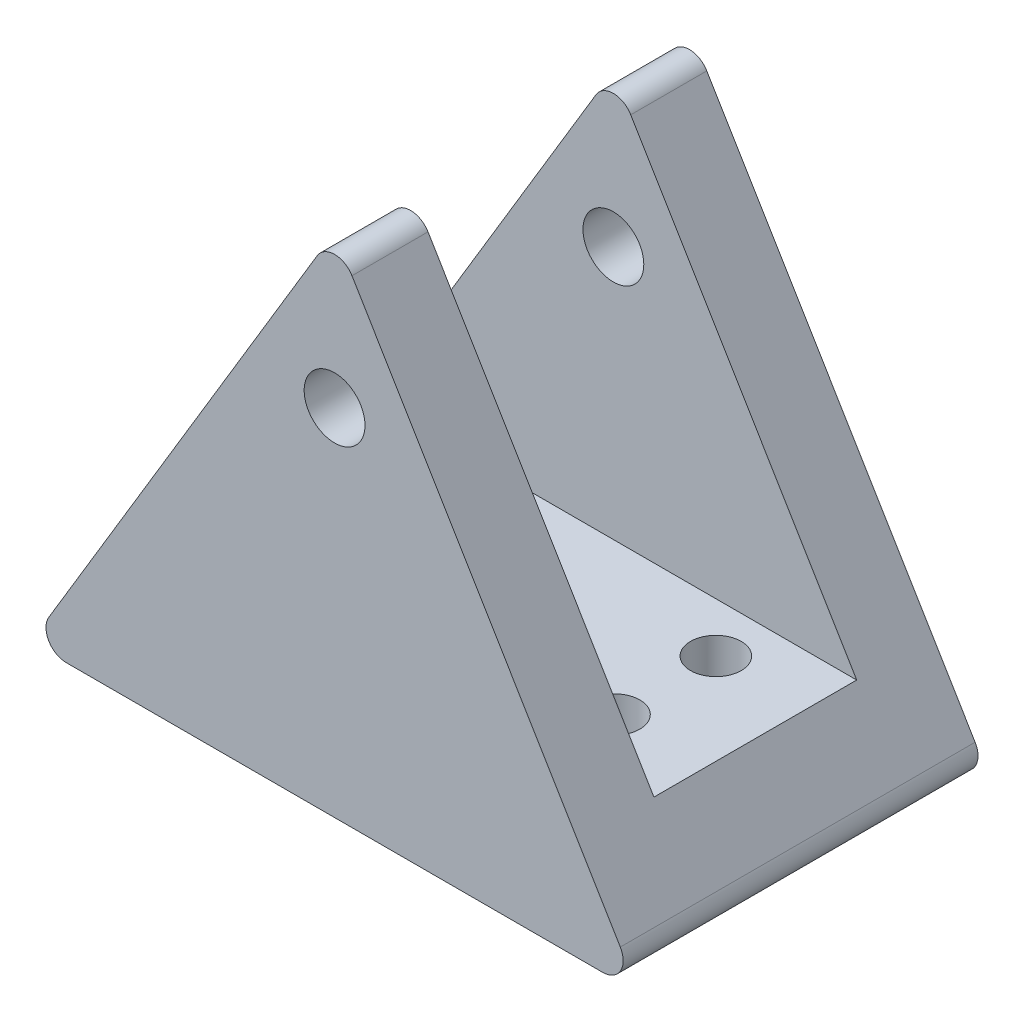
ISO-10303-21;
HEADER;
FILE_DESCRIPTION(('STEP AP214'),'2;1');
FILE_NAME('part.step','',(''),(''),'','','');
FILE_SCHEMA(('AUTOMOTIVE_DESIGN { 1 0 10303 214 1 1 1 1 }'));
ENDSEC;
DATA;
#1=APPLICATION_CONTEXT('core data for automotive mechanical design processes');
#2=APPLICATION_PROTOCOL_DEFINITION('international standard','automotive_design',2000,#1);
#3=PRODUCT_CONTEXT('',#1,'mechanical');
#4=PRODUCT('Part','Part','',(#3));
#5=PRODUCT_RELATED_PRODUCT_CATEGORY('part','',(#4));
#6=PRODUCT_DEFINITION_FORMATION('','',#4);
#7=PRODUCT_DEFINITION_CONTEXT('part definition',#1,'design');
#8=PRODUCT_DEFINITION('design','',#6,#7);
#9=PRODUCT_DEFINITION_SHAPE('','',#8);
#10=(LENGTH_UNIT() NAMED_UNIT(*) SI_UNIT(.MILLI.,.METRE.));
#11=(NAMED_UNIT(*) PLANE_ANGLE_UNIT() SI_UNIT($,.RADIAN.));
#12=(NAMED_UNIT(*) SI_UNIT($,.STERADIAN.) SOLID_ANGLE_UNIT());
#13=UNCERTAINTY_MEASURE_WITH_UNIT(LENGTH_MEASURE(1.E-05),#10,'distance_accuracy_value','');
#14=(GEOMETRIC_REPRESENTATION_CONTEXT(3) GLOBAL_UNCERTAINTY_ASSIGNED_CONTEXT((#13)) GLOBAL_UNIT_ASSIGNED_CONTEXT((#10,
#11,#12)) REPRESENTATION_CONTEXT('',''));
#15=CARTESIAN_POINT('',(0.,0.,0.));
#16=DIRECTION('',(0.,0.,1.));
#17=DIRECTION('',(1.,0.,0.));
#18=AXIS2_PLACEMENT_3D('',#15,#16,#17);
#19=CARTESIAN_POINT('',(-38.1,-31.75,44.45));
#20=DIRECTION('',(0.,1.,0.));
#21=DIRECTION('',(0.,0.,1.));
#22=AXIS2_PLACEMENT_3D('',#19,#20,#21);
#23=PLANE('',#22);
#24=CARTESIAN_POINT('',(-19.05,-31.75,28.4370332123904));
#25=DIRECTION('',(0.,1.,0.));
#26=DIRECTION('',(0.,0.,1.));
#27=AXIS2_PLACEMENT_3D('',#24,#25,#26);
#28=CIRCLE('',#27,3.17499999999999);
#29=CARTESIAN_POINT('',(-19.05,-31.75,31.6120332123904));
#30=VERTEX_POINT('',#29);
#31=EDGE_CURVE('E208',#30,#30,#28,.T.);
#32=ORIENTED_EDGE('',*,*,#31,.T.);
#33=EDGE_LOOP('',(#32));
#34=FACE_BOUND('',#33,.T.);
#35=CARTESIAN_POINT('',(19.05,-31.75,28.4370332123904));
#36=DIRECTION('',(0.,1.,0.));
#37=DIRECTION('',(0.,0.,1.));
#38=AXIS2_PLACEMENT_3D('',#35,#36,#37);
#39=CIRCLE('',#38,3.175);
#40=CARTESIAN_POINT('',(19.05,-31.75,31.6120332123904));
#41=VERTEX_POINT('',#40);
#42=EDGE_CURVE('E212',#41,#41,#39,.T.);
#43=ORIENTED_EDGE('',*,*,#42,.T.);
#44=EDGE_LOOP('',(#43));
#45=FACE_BOUND('',#44,.T.);
#46=CARTESIAN_POINT('',(19.05,-31.75,15.7370332123904));
#47=DIRECTION('',(0.,1.,0.));
#48=DIRECTION('',(0.,0.,1.));
#49=AXIS2_PLACEMENT_3D('',#46,#47,#48);
#50=CIRCLE('',#49,3.175);
#51=CARTESIAN_POINT('',(19.05,-31.75,18.9120332123904));
#52=VERTEX_POINT('',#51);
#53=EDGE_CURVE('E215',#52,#52,#50,.T.);
#54=ORIENTED_EDGE('',*,*,#53,.T.);
#55=EDGE_LOOP('',(#54));
#56=FACE_BOUND('',#55,.T.);
#57=CARTESIAN_POINT('',(-19.05,-31.75,15.7370332123904));
#58=DIRECTION('',(0.,1.,0.));
#59=DIRECTION('',(0.,0.,1.));
#60=AXIS2_PLACEMENT_3D('',#57,#58,#59);
#61=CIRCLE('',#60,3.175);
#62=CARTESIAN_POINT('',(-19.05,-31.75,18.9120332123904));
#63=VERTEX_POINT('',#62);
#64=EDGE_CURVE('E218',#63,#63,#61,.T.);
#65=ORIENTED_EDGE('',*,*,#64,.T.);
#66=EDGE_LOOP('',(#65));
#67=FACE_BOUND('',#66,.T.);
#68=DIRECTION('',(1.,0.,0.));
#69=VECTOR('',#68,1.);
#70=CARTESIAN_POINT('',(-38.1,-31.75,0.));
#71=LINE('',#70,#69);
#72=CARTESIAN_POINT('',(-33.6138764374186,-31.75,0.));
#73=VERTEX_POINT('',#72);
#74=CARTESIAN_POINT('',(33.6138764374186,-31.75,0.));
#75=VERTEX_POINT('',#74);
#76=EDGE_CURVE('E140',#73,#75,#71,.T.);
#77=ORIENTED_EDGE('',*,*,#76,.T.);
#78=DIRECTION('',(0.,0.,-1.));
#79=VECTOR('',#78,1.);
#80=CARTESIAN_POINT('',(33.6138764374186,-31.75,44.45));
#81=LINE('',#80,#79);
#82=CARTESIAN_POINT('',(33.6138764374186,-31.75,44.45));
#83=VERTEX_POINT('',#82);
#84=EDGE_CURVE('E172',#75,#83,#81,.F.);
#85=ORIENTED_EDGE('',*,*,#84,.T.);
#86=DIRECTION('',(1.,0.,0.));
#87=VECTOR('',#86,1.);
#88=CARTESIAN_POINT('',(-38.1,-31.75,44.45));
#89=LINE('',#88,#87);
#90=CARTESIAN_POINT('',(-33.6138764374186,-31.75,44.45));
#91=VERTEX_POINT('',#90);
#92=EDGE_CURVE('E144',#91,#83,#89,.T.);
#93=ORIENTED_EDGE('',*,*,#92,.F.);
#94=DIRECTION('',(0.,0.,-1.));
#95=VECTOR('',#94,1.);
#96=CARTESIAN_POINT('',(-33.6138764374186,-31.75,44.45));
#97=LINE('',#96,#95);
#98=EDGE_CURVE('E169',#91,#73,#97,.T.);
#99=ORIENTED_EDGE('',*,*,#98,.T.);
#100=EDGE_LOOP('',(#77,#85,#93,#99));
#101=FACE_BOUND('',#100,.T.);
#102=ADVANCED_FACE('F36',(#34,#45,#56,#67,#101),#23,.F.);
#103=CARTESIAN_POINT('',(0.,0.,44.45));
#104=DIRECTION('',(0.,0.,1.));
#105=DIRECTION('',(1.,0.,0.));
#106=AXIS2_PLACEMENT_3D('',#103,#104,#105);
#107=PLANE('',#106);
#108=CARTESIAN_POINT('',(0.,12.7,44.45));
#109=DIRECTION('',(0.,0.,1.));
#110=DIRECTION('',(1.,0.,0.));
#111=AXIS2_PLACEMENT_3D('',#108,#109,#110);
#112=CIRCLE('',#111,3.81);
#113=CARTESIAN_POINT('',(3.81,12.7,44.45));
#114=VERTEX_POINT('',#113);
#115=EDGE_CURVE('E235',#114,#114,#112,.T.);
#116=ORIENTED_EDGE('',*,*,#115,.F.);
#117=EDGE_LOOP('',(#116));
#118=FACE_BOUND('',#117,.T.);
#119=ORIENTED_EDGE('',*,*,#92,.T.);
#120=CARTESIAN_POINT('',(33.6138764374186,-29.21,44.45));
#121=DIRECTION('',(0.,0.,1.));
#122=DIRECTION('',(1.,0.,0.));
#123=AXIS2_PLACEMENT_3D('',#120,#121,#122);
#124=CIRCLE('',#123,2.54);
#125=CARTESIAN_POINT('',(35.7919084687285,-27.9031807812141,44.45));
#126=VERTEX_POINT('',#125);
#127=EDGE_CURVE('E178',#83,#126,#124,.T.);
#128=ORIENTED_EDGE('',*,*,#127,.T.);
#129=DIRECTION('',(0.514495755427527,-0.857492925712544,0.));
#130=VECTOR('',#129,1.);
#131=CARTESIAN_POINT('',(0.,31.75,44.45));
#132=LINE('',#131,#130);
#133=CARTESIAN_POINT('',(2.17803203130984,28.1199466144836,44.45));
#134=VERTEX_POINT('',#133);
#135=EDGE_CURVE('E206',#134,#126,#132,.T.);
#136=ORIENTED_EDGE('',*,*,#135,.F.);
#137=CARTESIAN_POINT('',(0.,26.8131273956976,44.45));
#138=DIRECTION('',(0.,0.,1.));
#139=DIRECTION('',(1.,0.,0.));
#140=AXIS2_PLACEMENT_3D('',#137,#138,#139);
#141=CIRCLE('',#140,2.54);
#142=CARTESIAN_POINT('',(-2.17803203130988,28.1199466144836,44.45));
#143=VERTEX_POINT('',#142);
#144=EDGE_CURVE('E176',#134,#143,#141,.T.);
#145=ORIENTED_EDGE('',*,*,#144,.T.);
#146=DIRECTION('',(0.514495755427526,0.857492925712544,0.));
#147=VECTOR('',#146,1.);
#148=CARTESIAN_POINT('',(-38.1,-31.75,44.45));
#149=LINE('',#148,#147);
#150=CARTESIAN_POINT('',(-35.7919084687285,-27.9031807812141,44.45));
#151=VERTEX_POINT('',#150);
#152=EDGE_CURVE('E197',#151,#143,#149,.T.);
#153=ORIENTED_EDGE('',*,*,#152,.F.);
#154=CARTESIAN_POINT('',(-33.6138764374186,-29.21,44.45));
#155=DIRECTION('',(0.,0.,1.));
#156=DIRECTION('',(1.,0.,0.));
#157=AXIS2_PLACEMENT_3D('',#154,#155,#156);
#158=CIRCLE('',#157,2.54);
#159=EDGE_CURVE('E174',#151,#91,#158,.T.);
#160=ORIENTED_EDGE('',*,*,#159,.T.);
#161=EDGE_LOOP('',(#119,#128,#136,#145,#153,#160));
#162=FACE_BOUND('',#161,.T.);
#163=ADVANCED_FACE('F258',(#118,#162),#107,.T.);
#164=CARTESIAN_POINT('',(0.,0.,0.));
#165=DIRECTION('',(0.,0.,1.));
#166=DIRECTION('',(1.,0.,0.));
#167=AXIS2_PLACEMENT_3D('',#164,#165,#166);
#168=PLANE('',#167);
#169=CARTESIAN_POINT('',(0.,12.7,0.));
#170=DIRECTION('',(0.,0.,1.));
#171=DIRECTION('',(1.,0.,0.));
#172=AXIS2_PLACEMENT_3D('',#169,#170,#171);
#173=CIRCLE('',#172,3.81);
#174=CARTESIAN_POINT('',(3.81,12.7,0.));
#175=VERTEX_POINT('',#174);
#176=EDGE_CURVE('E156',#175,#175,#173,.T.);
#177=ORIENTED_EDGE('',*,*,#176,.T.);
#178=EDGE_LOOP('',(#177));
#179=FACE_BOUND('',#178,.T.);
#180=DIRECTION('',(0.514495755427527,-0.857492925712544,0.));
#181=VECTOR('',#180,1.);
#182=CARTESIAN_POINT('',(0.,31.75,0.));
#183=LINE('',#182,#181);
#184=CARTESIAN_POINT('',(2.17803203130984,28.1199466144836,0.));
#185=VERTEX_POINT('',#184);
#186=CARTESIAN_POINT('',(35.7919084687285,-27.9031807812141,0.));
#187=VERTEX_POINT('',#186);
#188=EDGE_CURVE('E122',#185,#187,#183,.T.);
#189=ORIENTED_EDGE('',*,*,#188,.T.);
#190=CARTESIAN_POINT('',(33.6138764374186,-29.21,0.));
#191=DIRECTION('',(0.,0.,1.));
#192=DIRECTION('',(1.,0.,0.));
#193=AXIS2_PLACEMENT_3D('',#190,#191,#192);
#194=CIRCLE('',#193,2.54);
#195=EDGE_CURVE('E167',#187,#75,#194,.F.);
#196=ORIENTED_EDGE('',*,*,#195,.T.);
#197=ORIENTED_EDGE('',*,*,#76,.F.);
#198=CARTESIAN_POINT('',(-33.6138764374186,-29.21,0.));
#199=DIRECTION('',(0.,0.,1.));
#200=DIRECTION('',(1.,0.,0.));
#201=AXIS2_PLACEMENT_3D('',#198,#199,#200);
#202=CIRCLE('',#201,2.54);
#203=CARTESIAN_POINT('',(-35.7919084687285,-27.9031807812141,0.));
#204=VERTEX_POINT('',#203);
#205=EDGE_CURVE('E163',#73,#204,#202,.F.);
#206=ORIENTED_EDGE('',*,*,#205,.T.);
#207=DIRECTION('',(0.514495755427526,0.857492925712544,0.));
#208=VECTOR('',#207,1.);
#209=CARTESIAN_POINT('',(-38.1,-31.75,0.));
#210=LINE('',#209,#208);
#211=CARTESIAN_POINT('',(-2.17803203130988,28.1199466144836,0.));
#212=VERTEX_POINT('',#211);
#213=EDGE_CURVE('E188',#204,#212,#210,.T.);
#214=ORIENTED_EDGE('',*,*,#213,.T.);
#215=CARTESIAN_POINT('',(0.,26.8131273956976,0.));
#216=DIRECTION('',(0.,0.,1.));
#217=DIRECTION('',(1.,0.,0.));
#218=AXIS2_PLACEMENT_3D('',#215,#216,#217);
#219=CIRCLE('',#218,2.54);
#220=EDGE_CURVE('E165',#212,#185,#219,.F.);
#221=ORIENTED_EDGE('',*,*,#220,.T.);
#222=EDGE_LOOP('',(#189,#196,#197,#206,#214,#221));
#223=FACE_BOUND('',#222,.T.);
#224=ADVANCED_FACE('F194',(#179,#223),#168,.F.);
#225=CARTESIAN_POINT('',(-38.1,31.75,9.52500000000001));
#226=DIRECTION('',(0.,0.,-1.));
#227=DIRECTION('',(0.,1.,0.));
#228=AXIS2_PLACEMENT_3D('',#225,#226,#227);
#229=PLANE('',#228);
#230=CARTESIAN_POINT('',(0.,12.7,9.525));
#231=DIRECTION('',(0.,0.,-1.));
#232=DIRECTION('',(0.,1.,0.));
#233=AXIS2_PLACEMENT_3D('',#230,#231,#232);
#234=CIRCLE('',#233,3.81);
#235=CARTESIAN_POINT('',(0.,16.51,9.525));
#236=VERTEX_POINT('',#235);
#237=EDGE_CURVE('E155',#236,#236,#234,.T.);
#238=ORIENTED_EDGE('',*,*,#237,.T.);
#239=EDGE_LOOP('',(#238));
#240=FACE_BOUND('',#239,.T.);
#241=DIRECTION('',(-0.514495755427527,0.857492925712544,0.));
#242=VECTOR('',#241,1.);
#243=CARTESIAN_POINT('',(-10.0852941176471,48.5588235294118,9.52500000000001));
#244=LINE('',#243,#242);
#245=CARTESIAN_POINT('',(30.48,-19.05,9.52499999999999));
#246=VERTEX_POINT('',#245);
#247=CARTESIAN_POINT('',(2.17803203130985,28.1199466144836,9.52500000000001));
#248=VERTEX_POINT('',#247);
#249=EDGE_CURVE('E128',#246,#248,#244,.T.);
#250=ORIENTED_EDGE('',*,*,#249,.T.);
#251=CARTESIAN_POINT('',(0.,26.8131273956976,9.525));
#252=DIRECTION('',(0.,0.,-1.));
#253=DIRECTION('',(0.,1.,0.));
#254=AXIS2_PLACEMENT_3D('',#251,#252,#253);
#255=CIRCLE('',#254,2.54);
#256=CARTESIAN_POINT('',(-2.17803203130989,28.1199466144836,9.525));
#257=VERTEX_POINT('',#256);
#258=EDGE_CURVE('E11',#248,#257,#255,.F.);
#259=ORIENTED_EDGE('',*,*,#258,.T.);
#260=DIRECTION('',(-0.514495755427526,-0.857492925712544,0.));
#261=VECTOR('',#260,1.);
#262=CARTESIAN_POINT('',(-10.0852941176471,14.9411764705882,9.525));
#263=LINE('',#262,#261);
#264=CARTESIAN_POINT('',(-30.48,-19.05,9.52499999999999));
#265=VERTEX_POINT('',#264);
#266=EDGE_CURVE('E138',#257,#265,#263,.T.);
#267=ORIENTED_EDGE('',*,*,#266,.T.);
#268=DIRECTION('',(1.,0.,0.));
#269=VECTOR('',#268,1.);
#270=CARTESIAN_POINT('',(-38.1,-19.05,9.52499999999999));
#271=LINE('',#270,#269);
#272=EDGE_CURVE('E137',#265,#246,#271,.T.);
#273=ORIENTED_EDGE('',*,*,#272,.T.);
#274=EDGE_LOOP('',(#250,#259,#267,#273));
#275=FACE_BOUND('',#274,.T.);
#276=ADVANCED_FACE('F201',(#240,#275),#229,.F.);
#277=CARTESIAN_POINT('',(-38.1,-19.05,34.925));
#278=DIRECTION('',(0.,-1.,0.));
#279=DIRECTION('',(0.,0.,-1.));
#280=AXIS2_PLACEMENT_3D('',#277,#278,#279);
#281=PLANE('',#280);
#282=CARTESIAN_POINT('',(-19.05,-19.05,28.4370332123904));
#283=DIRECTION('',(0.,1.,0.));
#284=DIRECTION('',(1.,0.,0.));
#285=AXIS2_PLACEMENT_3D('',#282,#283,#284);
#286=CIRCLE('',#285,3.17499999999999);
#287=CARTESIAN_POINT('',(-15.875,-19.05,28.4370332123904));
#288=VERTEX_POINT('',#287);
#289=EDGE_CURVE('E225',#288,#288,#286,.T.);
#290=ORIENTED_EDGE('',*,*,#289,.F.);
#291=EDGE_LOOP('',(#290));
#292=FACE_BOUND('',#291,.T.);
#293=CARTESIAN_POINT('',(19.05,-19.05,28.4370332123904));
#294=DIRECTION('',(0.,1.,0.));
#295=DIRECTION('',(-1.,0.,0.));
#296=AXIS2_PLACEMENT_3D('',#293,#294,#295);
#297=CIRCLE('',#296,3.175);
#298=CARTESIAN_POINT('',(15.875,-19.05,28.4370332123904));
#299=VERTEX_POINT('',#298);
#300=EDGE_CURVE('E228',#299,#299,#297,.T.);
#301=ORIENTED_EDGE('',*,*,#300,.F.);
#302=EDGE_LOOP('',(#301));
#303=FACE_BOUND('',#302,.T.);
#304=CARTESIAN_POINT('',(19.05,-19.05,15.7370332123904));
#305=DIRECTION('',(0.,1.,0.));
#306=DIRECTION('',(1.,0.,0.));
#307=AXIS2_PLACEMENT_3D('',#304,#305,#306);
#308=CIRCLE('',#307,3.175);
#309=CARTESIAN_POINT('',(22.225,-19.05,15.7370332123904));
#310=VERTEX_POINT('',#309);
#311=EDGE_CURVE('E224',#310,#310,#308,.T.);
#312=ORIENTED_EDGE('',*,*,#311,.F.);
#313=EDGE_LOOP('',(#312));
#314=FACE_BOUND('',#313,.T.);
#315=CARTESIAN_POINT('',(-19.05,-19.05,15.7370332123904));
#316=DIRECTION('',(0.,1.,0.));
#317=DIRECTION('',(-1.,0.,0.));
#318=AXIS2_PLACEMENT_3D('',#315,#316,#317);
#319=CIRCLE('',#318,3.175);
#320=CARTESIAN_POINT('',(-22.225,-19.05,15.7370332123904));
#321=VERTEX_POINT('',#320);
#322=EDGE_CURVE('E221',#321,#321,#319,.T.);
#323=ORIENTED_EDGE('',*,*,#322,.F.);
#324=EDGE_LOOP('',(#323));
#325=FACE_BOUND('',#324,.T.);
#326=DIRECTION('',(1.,0.,0.));
#327=VECTOR('',#326,1.);
#328=CARTESIAN_POINT('',(-38.1,-19.05,34.925));
#329=LINE('',#328,#327);
#330=CARTESIAN_POINT('',(-30.48,-19.05,34.925));
#331=VERTEX_POINT('',#330);
#332=CARTESIAN_POINT('',(30.48,-19.05,34.925));
#333=VERTEX_POINT('',#332);
#334=EDGE_CURVE('E116',#331,#333,#329,.T.);
#335=ORIENTED_EDGE('',*,*,#334,.T.);
#336=DIRECTION('',(0.,0.,-1.));
#337=VECTOR('',#336,1.);
#338=CARTESIAN_POINT('',(30.48,-19.05,34.925));
#339=LINE('',#338,#337);
#340=EDGE_CURVE('E121',#333,#246,#339,.T.);
#341=ORIENTED_EDGE('',*,*,#340,.T.);
#342=ORIENTED_EDGE('',*,*,#272,.F.);
#343=DIRECTION('',(0.,0.,1.));
#344=VECTOR('',#343,1.);
#345=CARTESIAN_POINT('',(-30.48,-19.05,34.925));
#346=LINE('',#345,#344);
#347=EDGE_CURVE('E136',#265,#331,#346,.T.);
#348=ORIENTED_EDGE('',*,*,#347,.T.);
#349=EDGE_LOOP('',(#335,#341,#342,#348));
#350=FACE_BOUND('',#349,.T.);
#351=ADVANCED_FACE('F134',(#292,#303,#314,#325,#350),#281,.F.);
#352=CARTESIAN_POINT('',(-38.1,-19.05,34.925));
#353=DIRECTION('',(0.,0.,1.));
#354=DIRECTION('',(1.,0.,0.));
#355=AXIS2_PLACEMENT_3D('',#352,#353,#354);
#356=PLANE('',#355);
#357=CARTESIAN_POINT('',(0.,12.7,34.925));
#358=DIRECTION('',(0.,0.,1.));
#359=DIRECTION('',(1.,0.,0.));
#360=AXIS2_PLACEMENT_3D('',#357,#358,#359);
#361=CIRCLE('',#360,3.81);
#362=CARTESIAN_POINT('',(3.81,12.7,34.925));
#363=VERTEX_POINT('',#362);
#364=EDGE_CURVE('E152',#363,#363,#361,.T.);
#365=ORIENTED_EDGE('',*,*,#364,.T.);
#366=EDGE_LOOP('',(#365));
#367=FACE_BOUND('',#366,.T.);
#368=DIRECTION('',(0.514495755427526,0.857492925712544,0.));
#369=VECTOR('',#368,1.);
#370=CARTESIAN_POINT('',(-32.4970588235294,-22.4117647058824,34.925));
#371=LINE('',#370,#369);
#372=CARTESIAN_POINT('',(-2.17803203130988,28.1199466144836,34.925));
#373=VERTEX_POINT('',#372);
#374=EDGE_CURVE('E147',#331,#373,#371,.T.);
#375=ORIENTED_EDGE('',*,*,#374,.T.);
#376=CARTESIAN_POINT('',(0.,26.8131273956976,34.925));
#377=DIRECTION('',(0.,0.,1.));
#378=DIRECTION('',(1.,0.,0.));
#379=AXIS2_PLACEMENT_3D('',#376,#377,#378);
#380=CIRCLE('',#379,2.54);
#381=CARTESIAN_POINT('',(2.17803203130985,28.1199466144836,34.925));
#382=VERTEX_POINT('',#381);
#383=EDGE_CURVE('E44',#373,#382,#380,.F.);
#384=ORIENTED_EDGE('',*,*,#383,.T.);
#385=DIRECTION('',(0.514495755427527,-0.857492925712544,0.));
#386=VECTOR('',#385,1.);
#387=CARTESIAN_POINT('',(12.3264705882353,11.2058823529412,34.925));
#388=LINE('',#387,#386);
#389=EDGE_CURVE('E112',#382,#333,#388,.T.);
#390=ORIENTED_EDGE('',*,*,#389,.T.);
#391=ORIENTED_EDGE('',*,*,#334,.F.);
#392=EDGE_LOOP('',(#375,#384,#390,#391));
#393=FACE_BOUND('',#392,.T.);
#394=ADVANCED_FACE('F114',(#367,#393),#356,.F.);
#395=CARTESIAN_POINT('',(-38.1,-31.75,0.));
#396=DIRECTION('',(0.857492925712544,-0.514495755427526,0.));
#397=DIRECTION('',(0.514495755427526,0.857492925712544,0.));
#398=AXIS2_PLACEMENT_3D('',#395,#396,#397);
#399=PLANE('',#398);
#400=ORIENTED_EDGE('',*,*,#152,.T.);
#401=DIRECTION('',(0.,0.,1.));
#402=VECTOR('',#401,1.);
#403=CARTESIAN_POINT('',(-2.17803203130987,28.1199466144836,0.));
#404=LINE('',#403,#402);
#405=EDGE_CURVE('E57',#143,#373,#404,.F.);
#406=ORIENTED_EDGE('',*,*,#405,.T.);
#407=ORIENTED_EDGE('',*,*,#374,.F.);
#408=ORIENTED_EDGE('',*,*,#347,.F.);
#409=ORIENTED_EDGE('',*,*,#266,.F.);
#410=DIRECTION('',(0.,0.,1.));
#411=VECTOR('',#410,1.);
#412=CARTESIAN_POINT('',(-2.17803203130987,28.1199466144836,0.));
#413=LINE('',#412,#411);
#414=EDGE_CURVE('E182',#257,#212,#413,.F.);
#415=ORIENTED_EDGE('',*,*,#414,.T.);
#416=ORIENTED_EDGE('',*,*,#213,.F.);
#417=DIRECTION('',(0.,0.,-1.));
#418=VECTOR('',#417,1.);
#419=CARTESIAN_POINT('',(-35.7919084687285,-27.9031807812141,0.));
#420=LINE('',#419,#418);
#421=EDGE_CURVE('E180',#204,#151,#420,.F.);
#422=ORIENTED_EDGE('',*,*,#421,.T.);
#423=EDGE_LOOP('',(#400,#406,#407,#408,#409,#415,#416,#422));
#424=FACE_BOUND('',#423,.T.);
#425=ADVANCED_FACE('F187',(#424),#399,.F.);
#426=CARTESIAN_POINT('',(0.,31.75,0.));
#427=DIRECTION('',(-0.857492925712544,-0.514495755427527,0.));
#428=DIRECTION('',(0.514495755427527,-0.857492925712544,0.));
#429=AXIS2_PLACEMENT_3D('',#426,#427,#428);
#430=PLANE('',#429);
#431=ORIENTED_EDGE('',*,*,#135,.T.);
#432=DIRECTION('',(0.,0.,-1.));
#433=VECTOR('',#432,1.);
#434=CARTESIAN_POINT('',(35.7919084687285,-27.9031807812141,0.));
#435=LINE('',#434,#433);
#436=EDGE_CURVE('E160',#126,#187,#435,.T.);
#437=ORIENTED_EDGE('',*,*,#436,.T.);
#438=ORIENTED_EDGE('',*,*,#188,.F.);
#439=DIRECTION('',(0.,0.,1.));
#440=VECTOR('',#439,1.);
#441=CARTESIAN_POINT('',(2.17803203130984,28.1199466144836,0.));
#442=LINE('',#441,#440);
#443=EDGE_CURVE('E151',#185,#248,#442,.T.);
#444=ORIENTED_EDGE('',*,*,#443,.T.);
#445=ORIENTED_EDGE('',*,*,#249,.F.);
#446=ORIENTED_EDGE('',*,*,#340,.F.);
#447=ORIENTED_EDGE('',*,*,#389,.F.);
#448=DIRECTION('',(0.,0.,1.));
#449=VECTOR('',#448,1.);
#450=CARTESIAN_POINT('',(2.17803203130984,28.1199466144836,0.));
#451=LINE('',#450,#449);
#452=EDGE_CURVE('E158',#382,#134,#451,.T.);
#453=ORIENTED_EDGE('',*,*,#452,.T.);
#454=EDGE_LOOP('',(#431,#437,#438,#444,#445,#446,#447,#453));
#455=FACE_BOUND('',#454,.T.);
#456=ADVANCED_FACE('F126',(#455),#430,.F.);
#457=CARTESIAN_POINT('',(-19.05,-63.5,15.7370332123904));
#458=DIRECTION('',(0.,1.,0.));
#459=DIRECTION('',(-1.,0.,0.));
#460=AXIS2_PLACEMENT_3D('',#457,#458,#459);
#461=CYLINDRICAL_SURFACE('',#460,3.175);
#462=ORIENTED_EDGE('',*,*,#322,.T.);
#463=EDGE_LOOP('',(#462));
#464=FACE_BOUND('',#463,.T.);
#465=ORIENTED_EDGE('',*,*,#64,.F.);
#466=EDGE_LOOP('',(#465));
#467=FACE_BOUND('',#466,.T.);
#468=ADVANCED_FACE('F320',(#464,#467),#461,.F.);
#469=CARTESIAN_POINT('',(19.05,-63.5,15.7370332123904));
#470=DIRECTION('',(0.,1.,0.));
#471=DIRECTION('',(-1.,0.,0.));
#472=AXIS2_PLACEMENT_3D('',#469,#470,#471);
#473=CYLINDRICAL_SURFACE('',#472,3.175);
#474=ORIENTED_EDGE('',*,*,#311,.T.);
#475=EDGE_LOOP('',(#474));
#476=FACE_BOUND('',#475,.T.);
#477=ORIENTED_EDGE('',*,*,#53,.F.);
#478=EDGE_LOOP('',(#477));
#479=FACE_BOUND('',#478,.T.);
#480=ADVANCED_FACE('F392',(#476,#479),#473,.F.);
#481=CARTESIAN_POINT('',(19.05,-63.5,28.4370332123904));
#482=DIRECTION('',(0.,1.,0.));
#483=DIRECTION('',(-1.,0.,0.));
#484=AXIS2_PLACEMENT_3D('',#481,#482,#483);
#485=CYLINDRICAL_SURFACE('',#484,3.175);
#486=ORIENTED_EDGE('',*,*,#300,.T.);
#487=EDGE_LOOP('',(#486));
#488=FACE_BOUND('',#487,.T.);
#489=ORIENTED_EDGE('',*,*,#42,.F.);
#490=EDGE_LOOP('',(#489));
#491=FACE_BOUND('',#490,.T.);
#492=ADVANCED_FACE('F382',(#488,#491),#485,.F.);
#493=CARTESIAN_POINT('',(-19.05,-63.5,28.4370332123904));
#494=DIRECTION('',(0.,1.,0.));
#495=DIRECTION('',(-1.,0.,0.));
#496=AXIS2_PLACEMENT_3D('',#493,#494,#495);
#497=CYLINDRICAL_SURFACE('',#496,3.17499999999999);
#498=ORIENTED_EDGE('',*,*,#289,.T.);
#499=EDGE_LOOP('',(#498));
#500=FACE_BOUND('',#499,.T.);
#501=ORIENTED_EDGE('',*,*,#31,.F.);
#502=EDGE_LOOP('',(#501));
#503=FACE_BOUND('',#502,.T.);
#504=ADVANCED_FACE('F373',(#500,#503),#497,.F.);
#505=CARTESIAN_POINT('',(0.,12.7,0.));
#506=DIRECTION('',(0.,0.,1.));
#507=DIRECTION('',(1.,0.,0.));
#508=AXIS2_PLACEMENT_3D('',#505,#506,#507);
#509=CYLINDRICAL_SURFACE('',#508,3.81);
#510=ORIENTED_EDGE('',*,*,#115,.T.);
#511=EDGE_LOOP('',(#510));
#512=FACE_BOUND('',#511,.T.);
#513=ORIENTED_EDGE('',*,*,#364,.F.);
#514=EDGE_LOOP('',(#513));
#515=FACE_BOUND('',#514,.T.);
#516=ADVANCED_FACE('F246',(#512,#515),#509,.F.);
#517=ORIENTED_EDGE('',*,*,#176,.F.);
#518=EDGE_LOOP('',(#517));
#519=FACE_BOUND('',#518,.T.);
#520=ORIENTED_EDGE('',*,*,#237,.F.);
#521=EDGE_LOOP('',(#520));
#522=FACE_BOUND('',#521,.T.);
#523=ADVANCED_FACE('F242',(#519,#522),#509,.F.);
#524=CARTESIAN_POINT('',(33.6138764374186,-29.21,0.));
#525=DIRECTION('',(0.,0.,-1.));
#526=DIRECTION('',(-1.,0.,0.));
#527=AXIS2_PLACEMENT_3D('',#524,#525,#526);
#528=CYLINDRICAL_SURFACE('',#527,2.54);
#529=ORIENTED_EDGE('',*,*,#127,.F.);
#530=ORIENTED_EDGE('',*,*,#84,.F.);
#531=ORIENTED_EDGE('',*,*,#195,.F.);
#532=ORIENTED_EDGE('',*,*,#436,.F.);
#533=EDGE_LOOP('',(#529,#530,#531,#532));
#534=FACE_BOUND('',#533,.T.);
#535=ADVANCED_FACE('F245',(#534),#528,.T.);
#536=CARTESIAN_POINT('',(0.,26.8131273956976,0.));
#537=DIRECTION('',(0.,0.,1.));
#538=DIRECTION('',(1.,0.,0.));
#539=AXIS2_PLACEMENT_3D('',#536,#537,#538);
#540=CYLINDRICAL_SURFACE('',#539,2.54);
#541=ORIENTED_EDGE('',*,*,#383,.F.);
#542=ORIENTED_EDGE('',*,*,#405,.F.);
#543=ORIENTED_EDGE('',*,*,#144,.F.);
#544=ORIENTED_EDGE('',*,*,#452,.F.);
#545=EDGE_LOOP('',(#541,#542,#543,#544));
#546=FACE_BOUND('',#545,.T.);
#547=ADVANCED_FACE('F273',(#546),#540,.T.);
#548=CARTESIAN_POINT('',(0.,26.8131273956976,0.));
#549=DIRECTION('',(0.,0.,1.));
#550=DIRECTION('',(1.,0.,0.));
#551=AXIS2_PLACEMENT_3D('',#548,#549,#550);
#552=CYLINDRICAL_SURFACE('',#551,2.54);
#553=ORIENTED_EDGE('',*,*,#220,.F.);
#554=ORIENTED_EDGE('',*,*,#414,.F.);
#555=ORIENTED_EDGE('',*,*,#258,.F.);
#556=ORIENTED_EDGE('',*,*,#443,.F.);
#557=EDGE_LOOP('',(#553,#554,#555,#556));
#558=FACE_BOUND('',#557,.T.);
#559=ADVANCED_FACE('F200',(#558),#552,.T.);
#560=CARTESIAN_POINT('',(-33.6138764374186,-29.21,44.45));
#561=DIRECTION('',(0.,0.,-1.));
#562=DIRECTION('',(-1.,0.,0.));
#563=AXIS2_PLACEMENT_3D('',#560,#561,#562);
#564=CYLINDRICAL_SURFACE('',#563,2.54);
#565=ORIENTED_EDGE('',*,*,#159,.F.);
#566=ORIENTED_EDGE('',*,*,#421,.F.);
#567=ORIENTED_EDGE('',*,*,#205,.F.);
#568=ORIENTED_EDGE('',*,*,#98,.F.);
#569=EDGE_LOOP('',(#565,#566,#567,#568));
#570=FACE_BOUND('',#569,.T.);
#571=ADVANCED_FACE('F38',(#570),#564,.T.);
#572=CLOSED_SHELL('',(#102,#163,#224,#276,#351,#394,#425,#456,#468,#480,#492,#504,#516,#523,
#535,#547,#559,#571));
#573=MANIFOLD_SOLID_BREP('B2',#572);
#574=ADVANCED_BREP_SHAPE_REPRESENTATION('',(#18,#573),#14);
#575=SHAPE_DEFINITION_REPRESENTATION(#9,#574);
ENDSEC;
END-ISO-10303-21;
